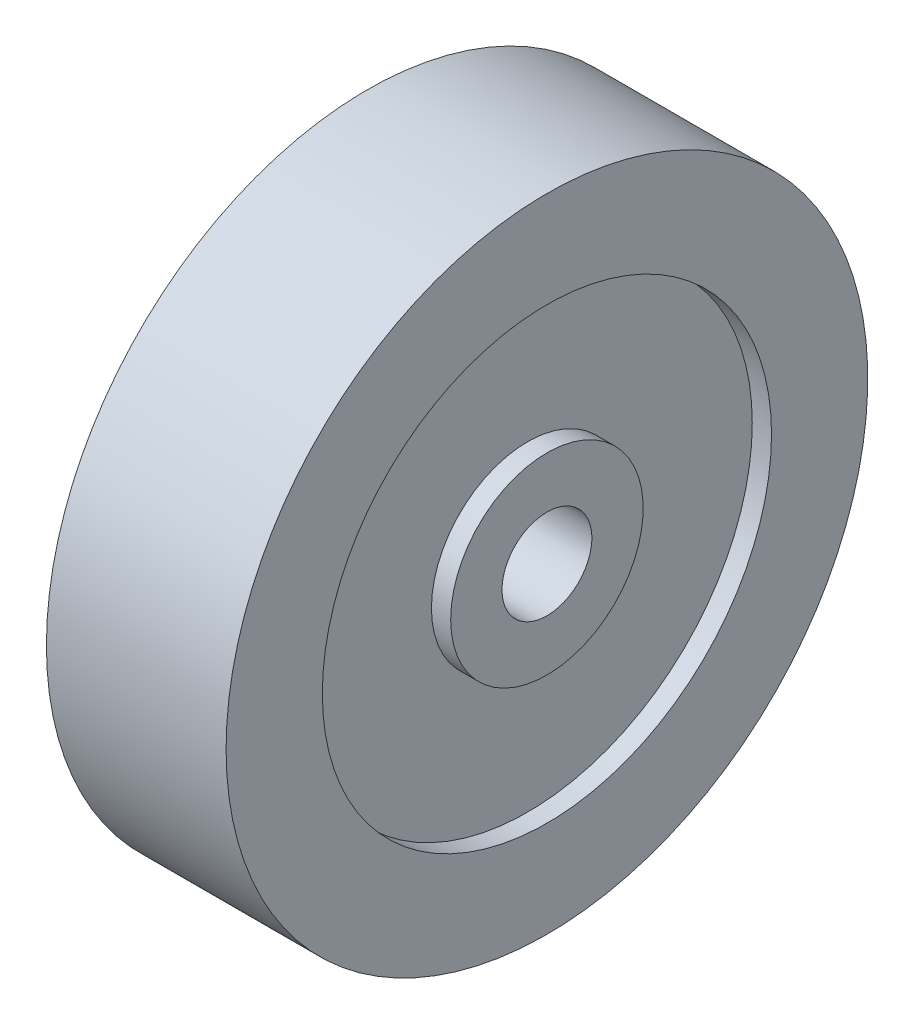
ISO-10303-21;
HEADER;
FILE_DESCRIPTION(('STEP AP214'),'2;1');
FILE_NAME('part.step','',(''),(''),'','','');
FILE_SCHEMA(('AUTOMOTIVE_DESIGN { 1 0 10303 214 1 1 1 1 }'));
ENDSEC;
DATA;
#1=APPLICATION_CONTEXT('core data for automotive mechanical design processes');
#2=APPLICATION_PROTOCOL_DEFINITION('international standard','automotive_design',2000,#1);
#3=PRODUCT_CONTEXT('',#1,'mechanical');
#4=PRODUCT('Part','Part','',(#3));
#5=PRODUCT_RELATED_PRODUCT_CATEGORY('part','',(#4));
#6=PRODUCT_DEFINITION_FORMATION('','',#4);
#7=PRODUCT_DEFINITION_CONTEXT('part definition',#1,'design');
#8=PRODUCT_DEFINITION('design','',#6,#7);
#9=PRODUCT_DEFINITION_SHAPE('','',#8);
#10=(LENGTH_UNIT() NAMED_UNIT(*) SI_UNIT(.MILLI.,.METRE.));
#11=(NAMED_UNIT(*) PLANE_ANGLE_UNIT() SI_UNIT($,.RADIAN.));
#12=(NAMED_UNIT(*) SI_UNIT($,.STERADIAN.) SOLID_ANGLE_UNIT());
#13=UNCERTAINTY_MEASURE_WITH_UNIT(LENGTH_MEASURE(1.E-05),#10,'distance_accuracy_value','');
#14=(GEOMETRIC_REPRESENTATION_CONTEXT(3) GLOBAL_UNCERTAINTY_ASSIGNED_CONTEXT((#13)) GLOBAL_UNIT_ASSIGNED_CONTEXT((#10,
#11,#12)) REPRESENTATION_CONTEXT('',''));
#15=CARTESIAN_POINT('',(0.,0.,0.));
#16=DIRECTION('',(0.,0.,1.));
#17=DIRECTION('',(1.,0.,0.));
#18=AXIS2_PLACEMENT_3D('',#15,#16,#17);
#19=CARTESIAN_POINT('',(0.,15.,0.));
#20=DIRECTION('',(-1.,0.,0.));
#21=DIRECTION('',(0.,0.,0.999999999999996));
#22=AXIS2_PLACEMENT_3D('',#19,#20,#21);
#23=PLANE('',#22);
#24=CARTESIAN_POINT('',(0.,49.9999999999999,0.));
#25=DIRECTION('',(-1.,0.,0.));
#26=DIRECTION('',(0.,0.,0.999999999999996));
#27=AXIS2_PLACEMENT_3D('',#24,#25,#26);
#28=CIRCLE('',#27,50.);
#29=CARTESIAN_POINT('',(0.,49.9999999999999,49.9999999999998));
#30=VERTEX_POINT('',#29);
#31=EDGE_CURVE('E12',#30,#30,#28,.T.);
#32=ORIENTED_EDGE('',*,*,#31,.T.);
#33=EDGE_LOOP('',(#32));
#34=FACE_BOUND('',#33,.T.);
#35=CARTESIAN_POINT('',(0.,49.9999999999999,0.));
#36=DIRECTION('',(-1.,0.,0.));
#37=DIRECTION('',(0.,0.,0.999999999999996));
#38=AXIS2_PLACEMENT_3D('',#35,#36,#37);
#39=CIRCLE('',#38,35.);
#40=CARTESIAN_POINT('',(0.,49.9999999999999,34.9999999999999));
#41=VERTEX_POINT('',#40);
#42=EDGE_CURVE('E82',#41,#41,#39,.T.);
#43=ORIENTED_EDGE('',*,*,#42,.F.);
#44=EDGE_LOOP('',(#43));
#45=FACE_BOUND('',#44,.T.);
#46=ADVANCED_FACE('F42',(#34,#45),#23,.T.);
#47=CARTESIAN_POINT('',(-31.9407407407407,49.9999999999999,0.));
#48=DIRECTION('',(-1.,0.,0.));
#49=DIRECTION('',(0.,0.,0.999999999999996));
#50=AXIS2_PLACEMENT_3D('',#47,#48,#49);
#51=CYLINDRICAL_SURFACE('',#50,50.);
#52=CARTESIAN_POINT('',(28.,49.9999999999999,0.));
#53=DIRECTION('',(-1.,0.,0.));
#54=DIRECTION('',(0.,0.,0.999999999999996));
#55=AXIS2_PLACEMENT_3D('',#52,#53,#54);
#56=CIRCLE('',#55,50.);
#57=CARTESIAN_POINT('',(28.,49.9999999999999,49.9999999999998));
#58=VERTEX_POINT('',#57);
#59=EDGE_CURVE('E48',#58,#58,#56,.T.);
#60=ORIENTED_EDGE('',*,*,#59,.T.);
#61=EDGE_LOOP('',(#60));
#62=FACE_BOUND('',#61,.T.);
#63=ORIENTED_EDGE('',*,*,#31,.F.);
#64=EDGE_LOOP('',(#63));
#65=FACE_BOUND('',#64,.T.);
#66=ADVANCED_FACE('F90',(#62,#65),#51,.T.);
#67=CARTESIAN_POINT('',(28.,0.,0.));
#68=DIRECTION('',(1.,0.,0.));
#69=DIRECTION('',(0.,0.,-0.999999999999996));
#70=AXIS2_PLACEMENT_3D('',#67,#68,#69);
#71=PLANE('',#70);
#72=CARTESIAN_POINT('',(28.,49.9999999999999,0.));
#73=DIRECTION('',(-1.,0.,0.));
#74=DIRECTION('',(0.,0.,0.999999999999996));
#75=AXIS2_PLACEMENT_3D('',#72,#73,#74);
#76=CIRCLE('',#75,35.);
#77=CARTESIAN_POINT('',(28.,49.9999999999999,34.9999999999999));
#78=VERTEX_POINT('',#77);
#79=EDGE_CURVE('E52',#78,#78,#76,.T.);
#80=ORIENTED_EDGE('',*,*,#79,.T.);
#81=EDGE_LOOP('',(#80));
#82=FACE_BOUND('',#81,.T.);
#83=ORIENTED_EDGE('',*,*,#59,.F.);
#84=EDGE_LOOP('',(#83));
#85=FACE_BOUND('',#84,.T.);
#86=ADVANCED_FACE('F94',(#82,#85),#71,.T.);
#87=CARTESIAN_POINT('',(-31.9407407407407,49.9999999999999,0.));
#88=DIRECTION('',(-1.,0.,0.));
#89=DIRECTION('',(0.,0.,0.999999999999996));
#90=AXIS2_PLACEMENT_3D('',#87,#88,#89);
#91=CYLINDRICAL_SURFACE('',#90,35.);
#92=CARTESIAN_POINT('',(25.,49.9999999999999,0.));
#93=DIRECTION('',(-1.,0.,0.));
#94=DIRECTION('',(0.,0.,0.999999999999996));
#95=AXIS2_PLACEMENT_3D('',#92,#93,#94);
#96=CIRCLE('',#95,35.);
#97=CARTESIAN_POINT('',(25.,49.9999999999999,34.9999999999999));
#98=VERTEX_POINT('',#97);
#99=EDGE_CURVE('E56',#98,#98,#96,.T.);
#100=ORIENTED_EDGE('',*,*,#99,.T.);
#101=EDGE_LOOP('',(#100));
#102=FACE_BOUND('',#101,.T.);
#103=ORIENTED_EDGE('',*,*,#79,.F.);
#104=EDGE_LOOP('',(#103));
#105=FACE_BOUND('',#104,.T.);
#106=ADVANCED_FACE('F98',(#102,#105),#91,.F.);
#107=CARTESIAN_POINT('',(25.,15.,0.));
#108=DIRECTION('',(1.,0.,0.));
#109=DIRECTION('',(0.,0.,-0.999999999999996));
#110=AXIS2_PLACEMENT_3D('',#107,#108,#109);
#111=PLANE('',#110);
#112=CARTESIAN_POINT('',(25.,49.9999999999999,0.));
#113=DIRECTION('',(-1.,0.,0.));
#114=DIRECTION('',(0.,0.,0.999999999999996));
#115=AXIS2_PLACEMENT_3D('',#112,#113,#114);
#116=CIRCLE('',#115,15.);
#117=CARTESIAN_POINT('',(25.,49.9999999999999,15.));
#118=VERTEX_POINT('',#117);
#119=EDGE_CURVE('E61',#118,#118,#116,.T.);
#120=ORIENTED_EDGE('',*,*,#119,.T.);
#121=EDGE_LOOP('',(#120));
#122=FACE_BOUND('',#121,.T.);
#123=ORIENTED_EDGE('',*,*,#99,.F.);
#124=EDGE_LOOP('',(#123));
#125=FACE_BOUND('',#124,.T.);
#126=ADVANCED_FACE('F105',(#122,#125),#111,.T.);
#127=CARTESIAN_POINT('',(-31.9407407407407,49.9999999999999,0.));
#128=DIRECTION('',(-1.,0.,0.));
#129=DIRECTION('',(0.,0.,0.999999999999996));
#130=AXIS2_PLACEMENT_3D('',#127,#128,#129);
#131=CYLINDRICAL_SURFACE('',#130,15.);
#132=CARTESIAN_POINT('',(28.,49.9999999999999,0.));
#133=DIRECTION('',(-1.,0.,0.));
#134=DIRECTION('',(0.,0.,0.999999999999996));
#135=AXIS2_PLACEMENT_3D('',#132,#133,#134);
#136=CIRCLE('',#135,15.);
#137=CARTESIAN_POINT('',(28.,49.9999999999999,15.));
#138=VERTEX_POINT('',#137);
#139=EDGE_CURVE('E64',#138,#138,#136,.T.);
#140=ORIENTED_EDGE('',*,*,#139,.T.);
#141=EDGE_LOOP('',(#140));
#142=FACE_BOUND('',#141,.T.);
#143=ORIENTED_EDGE('',*,*,#119,.F.);
#144=EDGE_LOOP('',(#143));
#145=FACE_BOUND('',#144,.T.);
#146=ADVANCED_FACE('F109',(#142,#145),#131,.T.);
#147=CARTESIAN_POINT('',(28.,34.9999999999999,0.));
#148=DIRECTION('',(1.,0.,0.));
#149=DIRECTION('',(0.,0.,-0.999999999999996));
#150=AXIS2_PLACEMENT_3D('',#147,#148,#149);
#151=PLANE('',#150);
#152=CARTESIAN_POINT('',(28.,49.9999999999999,0.));
#153=DIRECTION('',(-1.,0.,0.));
#154=DIRECTION('',(0.,0.,0.999999999999996));
#155=AXIS2_PLACEMENT_3D('',#152,#153,#154);
#156=CIRCLE('',#155,6.99999999999999);
#157=CARTESIAN_POINT('',(28.,49.9999999999999,6.99999999999999));
#158=VERTEX_POINT('',#157);
#159=EDGE_CURVE('E67',#158,#158,#156,.T.);
#160=ORIENTED_EDGE('',*,*,#159,.T.);
#161=EDGE_LOOP('',(#160));
#162=FACE_BOUND('',#161,.T.);
#163=ORIENTED_EDGE('',*,*,#139,.F.);
#164=EDGE_LOOP('',(#163));
#165=FACE_BOUND('',#164,.T.);
#166=ADVANCED_FACE('F113',(#162,#165),#151,.T.);
#167=CARTESIAN_POINT('',(-31.9407407407407,49.9999999999999,0.));
#168=DIRECTION('',(-1.,0.,0.));
#169=DIRECTION('',(0.,0.,0.999999999999996));
#170=AXIS2_PLACEMENT_3D('',#167,#168,#169);
#171=CYLINDRICAL_SURFACE('',#170,6.99999999999999);
#172=CARTESIAN_POINT('',(0.,49.9999999999999,0.));
#173=DIRECTION('',(-1.,0.,0.));
#174=DIRECTION('',(0.,0.,0.999999999999996));
#175=AXIS2_PLACEMENT_3D('',#172,#173,#174);
#176=CIRCLE('',#175,6.99999999999999);
#177=CARTESIAN_POINT('',(0.,49.9999999999999,6.99999999999999));
#178=VERTEX_POINT('',#177);
#179=EDGE_CURVE('E70',#178,#178,#176,.T.);
#180=ORIENTED_EDGE('',*,*,#179,.T.);
#181=EDGE_LOOP('',(#180));
#182=FACE_BOUND('',#181,.T.);
#183=ORIENTED_EDGE('',*,*,#159,.F.);
#184=EDGE_LOOP('',(#183));
#185=FACE_BOUND('',#184,.T.);
#186=ADVANCED_FACE('F117',(#182,#185),#171,.F.);
#187=CARTESIAN_POINT('',(0.,42.9999999999998,0.));
#188=DIRECTION('',(-1.,0.,0.));
#189=DIRECTION('',(0.,0.,0.999999999999996));
#190=AXIS2_PLACEMENT_3D('',#187,#188,#189);
#191=PLANE('',#190);
#192=CARTESIAN_POINT('',(0.,49.9999999999999,0.));
#193=DIRECTION('',(-1.,0.,0.));
#194=DIRECTION('',(0.,0.,0.999999999999996));
#195=AXIS2_PLACEMENT_3D('',#192,#193,#194);
#196=CIRCLE('',#195,15.);
#197=CARTESIAN_POINT('',(0.,49.9999999999999,15.));
#198=VERTEX_POINT('',#197);
#199=EDGE_CURVE('E73',#198,#198,#196,.T.);
#200=ORIENTED_EDGE('',*,*,#199,.T.);
#201=EDGE_LOOP('',(#200));
#202=FACE_BOUND('',#201,.T.);
#203=ORIENTED_EDGE('',*,*,#179,.F.);
#204=EDGE_LOOP('',(#203));
#205=FACE_BOUND('',#204,.T.);
#206=ADVANCED_FACE('F121',(#202,#205),#191,.T.);
#207=CARTESIAN_POINT('',(-31.9407407407407,49.9999999999999,0.));
#208=DIRECTION('',(-1.,0.,0.));
#209=DIRECTION('',(0.,0.,0.999999999999996));
#210=AXIS2_PLACEMENT_3D('',#207,#208,#209);
#211=CYLINDRICAL_SURFACE('',#210,15.);
#212=CARTESIAN_POINT('',(3.,49.9999999999998,0.));
#213=DIRECTION('',(-1.,0.,0.));
#214=DIRECTION('',(0.,0.,0.999999999999996));
#215=AXIS2_PLACEMENT_3D('',#212,#213,#214);
#216=CIRCLE('',#215,15.);
#217=CARTESIAN_POINT('',(3.,49.9999999999998,15.));
#218=VERTEX_POINT('',#217);
#219=EDGE_CURVE('E76',#218,#218,#216,.T.);
#220=ORIENTED_EDGE('',*,*,#219,.T.);
#221=EDGE_LOOP('',(#220));
#222=FACE_BOUND('',#221,.T.);
#223=ORIENTED_EDGE('',*,*,#199,.F.);
#224=EDGE_LOOP('',(#223));
#225=FACE_BOUND('',#224,.T.);
#226=ADVANCED_FACE('F125',(#222,#225),#211,.T.);
#227=CARTESIAN_POINT('',(3.,34.9999999999999,0.));
#228=DIRECTION('',(-1.,0.,0.));
#229=DIRECTION('',(0.,0.,0.999999999999996));
#230=AXIS2_PLACEMENT_3D('',#227,#228,#229);
#231=PLANE('',#230);
#232=CARTESIAN_POINT('',(3.,49.9999999999998,0.));
#233=DIRECTION('',(-1.,0.,0.));
#234=DIRECTION('',(0.,0.,0.999999999999996));
#235=AXIS2_PLACEMENT_3D('',#232,#233,#234);
#236=CIRCLE('',#235,35.);
#237=CARTESIAN_POINT('',(3.,49.9999999999998,34.9999999999999));
#238=VERTEX_POINT('',#237);
#239=EDGE_CURVE('E79',#238,#238,#236,.T.);
#240=ORIENTED_EDGE('',*,*,#239,.T.);
#241=EDGE_LOOP('',(#240));
#242=FACE_BOUND('',#241,.T.);
#243=ORIENTED_EDGE('',*,*,#219,.F.);
#244=EDGE_LOOP('',(#243));
#245=FACE_BOUND('',#244,.T.);
#246=ADVANCED_FACE('F129',(#242,#245),#231,.T.);
#247=CARTESIAN_POINT('',(-31.9407407407407,49.9999999999999,0.));
#248=DIRECTION('',(-1.,0.,0.));
#249=DIRECTION('',(0.,0.,0.999999999999996));
#250=AXIS2_PLACEMENT_3D('',#247,#248,#249);
#251=CYLINDRICAL_SURFACE('',#250,35.);
#252=ORIENTED_EDGE('',*,*,#42,.T.);
#253=EDGE_LOOP('',(#252));
#254=FACE_BOUND('',#253,.T.);
#255=ORIENTED_EDGE('',*,*,#239,.F.);
#256=EDGE_LOOP('',(#255));
#257=FACE_BOUND('',#256,.T.);
#258=ADVANCED_FACE('F86',(#254,#257),#251,.F.);
#259=CLOSED_SHELL('',(#46,#66,#86,#106,#126,#146,#166,#186,#206,#226,#246,#258));
#260=MANIFOLD_SOLID_BREP('B2',#259);
#261=ADVANCED_BREP_SHAPE_REPRESENTATION('',(#18,#260),#14);
#262=SHAPE_DEFINITION_REPRESENTATION(#9,#261);
ENDSEC;
END-ISO-10303-21;
